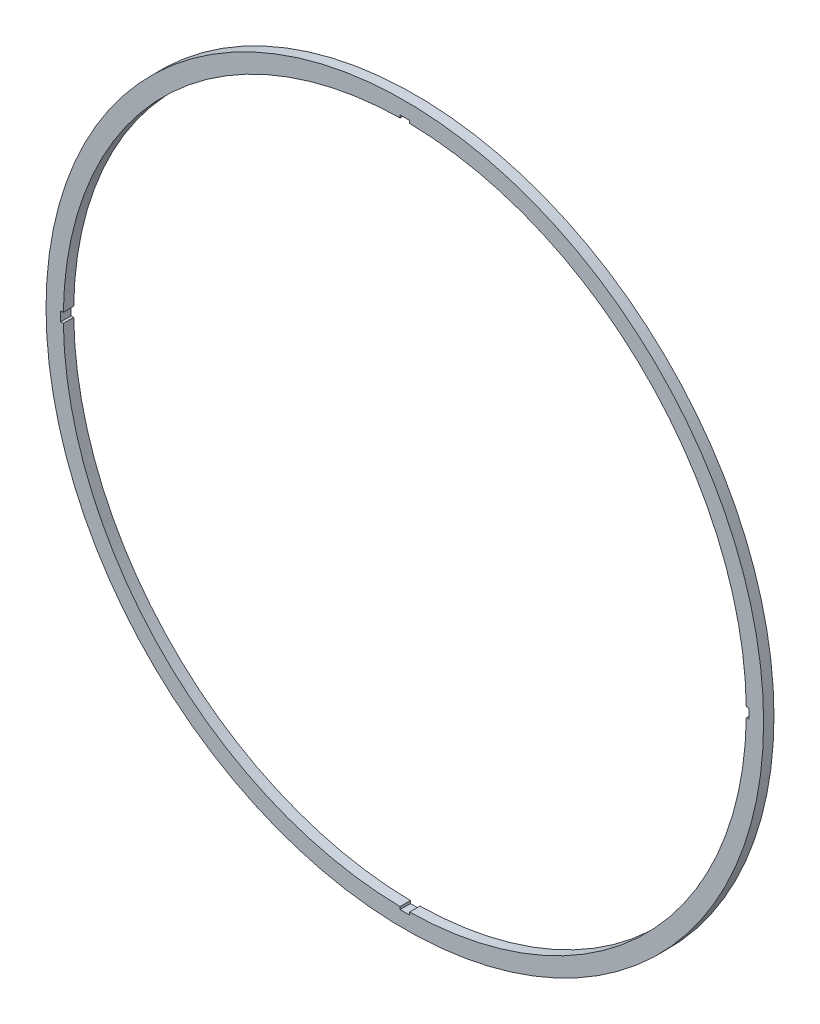
ISO-10303-21;
HEADER;
FILE_DESCRIPTION(('STEP AP214'),'2;1');
FILE_NAME('part.step','',(''),(''),'','','');
FILE_SCHEMA(('AUTOMOTIVE_DESIGN { 1 0 10303 214 1 1 1 1 }'));
ENDSEC;
DATA;
#1=APPLICATION_CONTEXT('core data for automotive mechanical design processes');
#2=APPLICATION_PROTOCOL_DEFINITION('international standard','automotive_design',2000,#1);
#3=PRODUCT_CONTEXT('',#1,'mechanical');
#4=PRODUCT('Part','Part','',(#3));
#5=PRODUCT_RELATED_PRODUCT_CATEGORY('part','',(#4));
#6=PRODUCT_DEFINITION_FORMATION('','',#4);
#7=PRODUCT_DEFINITION_CONTEXT('part definition',#1,'design');
#8=PRODUCT_DEFINITION('design','',#6,#7);
#9=PRODUCT_DEFINITION_SHAPE('','',#8);
#10=(LENGTH_UNIT() NAMED_UNIT(*) SI_UNIT(.MILLI.,.METRE.));
#11=(NAMED_UNIT(*) PLANE_ANGLE_UNIT() SI_UNIT($,.RADIAN.));
#12=(NAMED_UNIT(*) SI_UNIT($,.STERADIAN.) SOLID_ANGLE_UNIT());
#13=UNCERTAINTY_MEASURE_WITH_UNIT(LENGTH_MEASURE(1.E-05),#10,'distance_accuracy_value','');
#14=(GEOMETRIC_REPRESENTATION_CONTEXT(3) GLOBAL_UNCERTAINTY_ASSIGNED_CONTEXT((#13)) GLOBAL_UNIT_ASSIGNED_CONTEXT((#10,
#11,#12)) REPRESENTATION_CONTEXT('',''));
#15=CARTESIAN_POINT('',(0.,0.,0.));
#16=DIRECTION('',(0.,0.,1.));
#17=DIRECTION('',(1.,0.,0.));
#18=AXIS2_PLACEMENT_3D('',#15,#16,#17);
#19=CARTESIAN_POINT('',(0.,0.,12.));
#20=DIRECTION('',(0.,0.,1.));
#21=DIRECTION('',(1.,0.,0.));
#22=AXIS2_PLACEMENT_3D('',#19,#20,#21);
#23=PLANE('',#22);
#24=CARTESIAN_POINT('',(0.,0.,12.));
#25=DIRECTION('',(0.,0.,1.));
#26=DIRECTION('',(1.,0.,0.));
#27=AXIS2_PLACEMENT_3D('',#24,#25,#26);
#28=CIRCLE('',#27,415.);
#29=CARTESIAN_POINT('',(415.,0.,12.));
#30=VERTEX_POINT('',#29);
#31=EDGE_CURVE('E11',#30,#30,#28,.T.);
#32=ORIENTED_EDGE('',*,*,#31,.T.);
#33=EDGE_LOOP('',(#32));
#34=FACE_BOUND('',#33,.T.);
#35=CARTESIAN_POINT('',(0.,0.,12.));
#36=DIRECTION('',(0.,0.,1.));
#37=DIRECTION('',(1.,0.,0.));
#38=AXIS2_PLACEMENT_3D('',#35,#36,#37);
#39=CIRCLE('',#38,395.);
#40=CARTESIAN_POINT('',(-5.51162790697667,394.961544910153,12.));
#41=VERTEX_POINT('',#40);
#42=CARTESIAN_POINT('',(-394.961544910153,5.51162790695952,12.));
#43=VERTEX_POINT('',#42);
#44=EDGE_CURVE('E162',#41,#43,#39,.T.);
#45=ORIENTED_EDGE('',*,*,#44,.F.);
#46=DIRECTION('',(0.,-1.,0.));
#47=VECTOR('',#46,1.);
#48=CARTESIAN_POINT('',(-5.51162790697671,398.003407413043,12.));
#49=LINE('',#48,#47);
#50=CARTESIAN_POINT('',(-5.51162790697671,398.003407413043,12.));
#51=VERTEX_POINT('',#50);
#52=EDGE_CURVE('E153',#51,#41,#49,.T.);
#53=ORIENTED_EDGE('',*,*,#52,.F.);
#54=DIRECTION('',(-1.,0.,0.));
#55=VECTOR('',#54,1.);
#56=CARTESIAN_POINT('',(-5.51162790697671,398.003407413043,12.));
#57=LINE('',#56,#55);
#58=CARTESIAN_POINT('',(5.51162790695959,398.003407413043,12.));
#59=VERTEX_POINT('',#58);
#60=EDGE_CURVE('E217',#59,#51,#57,.T.);
#61=ORIENTED_EDGE('',*,*,#60,.F.);
#62=DIRECTION('',(0.,1.,0.));
#63=VECTOR('',#62,1.);
#64=CARTESIAN_POINT('',(5.51162790695959,398.003407413043,12.));
#65=LINE('',#64,#63);
#66=CARTESIAN_POINT('',(5.51162790695959,394.961544910153,12.));
#67=VERTEX_POINT('',#66);
#68=EDGE_CURVE('E214',#67,#59,#65,.T.);
#69=ORIENTED_EDGE('',*,*,#68,.F.);
#70=CARTESIAN_POINT('',(0.,0.,12.));
#71=DIRECTION('',(0.,0.,1.));
#72=DIRECTION('',(1.,0.,0.));
#73=AXIS2_PLACEMENT_3D('',#70,#71,#72);
#74=CIRCLE('',#73,395.);
#75=CARTESIAN_POINT('',(394.961544910153,5.51162790697673,12.));
#76=VERTEX_POINT('',#75);
#77=EDGE_CURVE('E211',#76,#67,#74,.T.);
#78=ORIENTED_EDGE('',*,*,#77,.F.);
#79=DIRECTION('',(-1.,0.,0.));
#80=VECTOR('',#79,1.);
#81=CARTESIAN_POINT('',(398.003407413043,5.51162790697673,12.));
#82=LINE('',#81,#80);
#83=CARTESIAN_POINT('',(398.003407413043,5.51162790697673,12.));
#84=VERTEX_POINT('',#83);
#85=EDGE_CURVE('E208',#84,#76,#82,.T.);
#86=ORIENTED_EDGE('',*,*,#85,.F.);
#87=DIRECTION('',(0.,1.,0.));
#88=VECTOR('',#87,1.);
#89=CARTESIAN_POINT('',(398.003407413043,5.51162790697673,12.));
#90=LINE('',#89,#88);
#91=CARTESIAN_POINT('',(398.003407413043,-5.51162790695956,12.));
#92=VERTEX_POINT('',#91);
#93=EDGE_CURVE('E205',#92,#84,#90,.T.);
#94=ORIENTED_EDGE('',*,*,#93,.F.);
#95=DIRECTION('',(1.,0.,0.));
#96=VECTOR('',#95,1.);
#97=CARTESIAN_POINT('',(398.003407413043,-5.51162790695956,12.));
#98=LINE('',#97,#96);
#99=CARTESIAN_POINT('',(394.961544910153,-5.51162790695957,12.));
#100=VERTEX_POINT('',#99);
#101=EDGE_CURVE('E202',#100,#92,#98,.T.);
#102=ORIENTED_EDGE('',*,*,#101,.F.);
#103=CARTESIAN_POINT('',(0.,0.,12.));
#104=DIRECTION('',(0.,0.,1.));
#105=DIRECTION('',(1.,0.,0.));
#106=AXIS2_PLACEMENT_3D('',#103,#104,#105);
#107=CIRCLE('',#106,395.);
#108=CARTESIAN_POINT('',(5.5116279069768,-394.961544910153,12.));
#109=VERTEX_POINT('',#108);
#110=EDGE_CURVE('E199',#109,#100,#107,.T.);
#111=ORIENTED_EDGE('',*,*,#110,.F.);
#112=DIRECTION('',(0.,1.,0.));
#113=VECTOR('',#112,1.);
#114=CARTESIAN_POINT('',(5.51162790697675,-398.003407413043,12.));
#115=LINE('',#114,#113);
#116=CARTESIAN_POINT('',(5.51162790697675,-398.003407413043,12.));
#117=VERTEX_POINT('',#116);
#118=EDGE_CURVE('E196',#117,#109,#115,.T.);
#119=ORIENTED_EDGE('',*,*,#118,.F.);
#120=DIRECTION('',(1.,0.,0.));
#121=VECTOR('',#120,1.);
#122=CARTESIAN_POINT('',(5.51162790697675,-398.003407413043,12.));
#123=LINE('',#122,#121);
#124=CARTESIAN_POINT('',(-5.51162790695954,-398.003407413043,12.));
#125=VERTEX_POINT('',#124);
#126=EDGE_CURVE('E193',#125,#117,#123,.T.);
#127=ORIENTED_EDGE('',*,*,#126,.F.);
#128=DIRECTION('',(0.,-1.,0.));
#129=VECTOR('',#128,1.);
#130=CARTESIAN_POINT('',(-5.51162790695954,-398.003407413043,12.));
#131=LINE('',#130,#129);
#132=CARTESIAN_POINT('',(-5.51162790695954,-394.961544910153,12.));
#133=VERTEX_POINT('',#132);
#134=EDGE_CURVE('E190',#133,#125,#131,.T.);
#135=ORIENTED_EDGE('',*,*,#134,.F.);
#136=CARTESIAN_POINT('',(0.,0.,12.));
#137=DIRECTION('',(0.,0.,1.));
#138=DIRECTION('',(1.,0.,0.));
#139=AXIS2_PLACEMENT_3D('',#136,#137,#138);
#140=CIRCLE('',#139,395.);
#141=CARTESIAN_POINT('',(-394.961544910153,-5.51162790697665,12.));
#142=VERTEX_POINT('',#141);
#143=EDGE_CURVE('E187',#142,#133,#140,.T.);
#144=ORIENTED_EDGE('',*,*,#143,.F.);
#145=DIRECTION('',(1.,0.,0.));
#146=VECTOR('',#145,1.);
#147=CARTESIAN_POINT('',(-398.003407413043,-5.51162790697678,12.));
#148=LINE('',#147,#146);
#149=CARTESIAN_POINT('',(-398.003407413043,-5.51162790697678,12.));
#150=VERTEX_POINT('',#149);
#151=EDGE_CURVE('E184',#150,#142,#148,.T.);
#152=ORIENTED_EDGE('',*,*,#151,.F.);
#153=DIRECTION('',(0.,-1.,0.));
#154=VECTOR('',#153,1.);
#155=CARTESIAN_POINT('',(-398.003407413043,-5.51162790697678,12.));
#156=LINE('',#155,#154);
#157=CARTESIAN_POINT('',(-398.003407413043,5.51162790695952,12.));
#158=VERTEX_POINT('',#157);
#159=EDGE_CURVE('E179',#158,#150,#156,.T.);
#160=ORIENTED_EDGE('',*,*,#159,.F.);
#161=DIRECTION('',(-1.,0.,0.));
#162=VECTOR('',#161,1.);
#163=CARTESIAN_POINT('',(-398.003407413043,5.51162790695952,12.));
#164=LINE('',#163,#162);
#165=EDGE_CURVE('E175',#43,#158,#164,.T.);
#166=ORIENTED_EDGE('',*,*,#165,.F.);
#167=EDGE_LOOP('',(#45,#53,#61,#69,#78,#86,#94,#102,#111,#119,#127,#135,#144,#152,#160,#166));
#168=FACE_BOUND('',#167,.T.);
#169=ADVANCED_FACE('F39',(#34,#168),#23,.T.);
#170=CARTESIAN_POINT('',(0.,0.,0.));
#171=DIRECTION('',(0.,0.,1.));
#172=DIRECTION('',(1.,0.,0.));
#173=AXIS2_PLACEMENT_3D('',#170,#171,#172);
#174=PLANE('',#173);
#175=CARTESIAN_POINT('',(0.,0.,0.));
#176=DIRECTION('',(0.,0.,1.));
#177=DIRECTION('',(1.,0.,0.));
#178=AXIS2_PLACEMENT_3D('',#175,#176,#177);
#179=CIRCLE('',#178,415.);
#180=CARTESIAN_POINT('',(415.,0.,0.));
#181=VERTEX_POINT('',#180);
#182=EDGE_CURVE('E43',#181,#181,#179,.T.);
#183=ORIENTED_EDGE('',*,*,#182,.F.);
#184=EDGE_LOOP('',(#183));
#185=FACE_BOUND('',#184,.T.);
#186=DIRECTION('',(0.,-1.,0.));
#187=VECTOR('',#186,1.);
#188=CARTESIAN_POINT('',(-5.51162790697671,398.003407413043,0.));
#189=LINE('',#188,#187);
#190=CARTESIAN_POINT('',(-5.51162790697671,398.003407413043,0.));
#191=VERTEX_POINT('',#190);
#192=CARTESIAN_POINT('',(-5.51162790697667,394.961544910153,0.));
#193=VERTEX_POINT('',#192);
#194=EDGE_CURVE('E63',#191,#193,#189,.T.);
#195=ORIENTED_EDGE('',*,*,#194,.T.);
#196=CARTESIAN_POINT('',(0.,0.,0.));
#197=DIRECTION('',(0.,0.,1.));
#198=DIRECTION('',(1.,0.,0.));
#199=AXIS2_PLACEMENT_3D('',#196,#197,#198);
#200=CIRCLE('',#199,395.);
#201=CARTESIAN_POINT('',(-394.961544910153,5.51162790695952,0.));
#202=VERTEX_POINT('',#201);
#203=EDGE_CURVE('E169',#193,#202,#200,.T.);
#204=ORIENTED_EDGE('',*,*,#203,.T.);
#205=DIRECTION('',(-1.,0.,0.));
#206=VECTOR('',#205,1.);
#207=CARTESIAN_POINT('',(-398.003407413043,5.51162790695952,0.));
#208=LINE('',#207,#206);
#209=CARTESIAN_POINT('',(-398.003407413043,5.51162790695952,0.));
#210=VERTEX_POINT('',#209);
#211=EDGE_CURVE('E224',#202,#210,#208,.T.);
#212=ORIENTED_EDGE('',*,*,#211,.T.);
#213=DIRECTION('',(0.,-1.,0.));
#214=VECTOR('',#213,1.);
#215=CARTESIAN_POINT('',(-398.003407413043,-5.51162790697678,0.));
#216=LINE('',#215,#214);
#217=CARTESIAN_POINT('',(-398.003407413043,-5.51162790697678,0.));
#218=VERTEX_POINT('',#217);
#219=EDGE_CURVE('E228',#210,#218,#216,.T.);
#220=ORIENTED_EDGE('',*,*,#219,.T.);
#221=DIRECTION('',(1.,0.,0.));
#222=VECTOR('',#221,1.);
#223=CARTESIAN_POINT('',(-398.003407413043,-5.51162790697678,0.));
#224=LINE('',#223,#222);
#225=CARTESIAN_POINT('',(-394.961544910153,-5.51162790697665,0.));
#226=VERTEX_POINT('',#225);
#227=EDGE_CURVE('E232',#218,#226,#224,.T.);
#228=ORIENTED_EDGE('',*,*,#227,.T.);
#229=CARTESIAN_POINT('',(0.,0.,0.));
#230=DIRECTION('',(0.,0.,1.));
#231=DIRECTION('',(1.,0.,0.));
#232=AXIS2_PLACEMENT_3D('',#229,#230,#231);
#233=CIRCLE('',#232,395.);
#234=CARTESIAN_POINT('',(-5.51162790695954,-394.961544910153,0.));
#235=VERTEX_POINT('',#234);
#236=EDGE_CURVE('E236',#226,#235,#233,.T.);
#237=ORIENTED_EDGE('',*,*,#236,.T.);
#238=DIRECTION('',(0.,-1.,0.));
#239=VECTOR('',#238,1.);
#240=CARTESIAN_POINT('',(-5.51162790695954,-398.003407413043,0.));
#241=LINE('',#240,#239);
#242=CARTESIAN_POINT('',(-5.51162790695954,-398.003407413043,0.));
#243=VERTEX_POINT('',#242);
#244=EDGE_CURVE('E240',#235,#243,#241,.T.);
#245=ORIENTED_EDGE('',*,*,#244,.T.);
#246=DIRECTION('',(1.,0.,0.));
#247=VECTOR('',#246,1.);
#248=CARTESIAN_POINT('',(5.51162790697675,-398.003407413043,0.));
#249=LINE('',#248,#247);
#250=CARTESIAN_POINT('',(5.51162790697675,-398.003407413043,0.));
#251=VERTEX_POINT('',#250);
#252=EDGE_CURVE('E244',#243,#251,#249,.T.);
#253=ORIENTED_EDGE('',*,*,#252,.T.);
#254=DIRECTION('',(0.,1.,0.));
#255=VECTOR('',#254,1.);
#256=CARTESIAN_POINT('',(5.51162790697675,-398.003407413043,0.));
#257=LINE('',#256,#255);
#258=CARTESIAN_POINT('',(5.5116279069768,-394.961544910153,0.));
#259=VERTEX_POINT('',#258);
#260=EDGE_CURVE('E248',#251,#259,#257,.T.);
#261=ORIENTED_EDGE('',*,*,#260,.T.);
#262=CARTESIAN_POINT('',(0.,0.,0.));
#263=DIRECTION('',(0.,0.,1.));
#264=DIRECTION('',(1.,0.,0.));
#265=AXIS2_PLACEMENT_3D('',#262,#263,#264);
#266=CIRCLE('',#265,395.);
#267=CARTESIAN_POINT('',(394.961544910153,-5.51162790695957,0.));
#268=VERTEX_POINT('',#267);
#269=EDGE_CURVE('E252',#259,#268,#266,.T.);
#270=ORIENTED_EDGE('',*,*,#269,.T.);
#271=DIRECTION('',(1.,0.,0.));
#272=VECTOR('',#271,1.);
#273=CARTESIAN_POINT('',(398.003407413043,-5.51162790695956,0.));
#274=LINE('',#273,#272);
#275=CARTESIAN_POINT('',(398.003407413043,-5.51162790695956,0.));
#276=VERTEX_POINT('',#275);
#277=EDGE_CURVE('E256',#268,#276,#274,.T.);
#278=ORIENTED_EDGE('',*,*,#277,.T.);
#279=DIRECTION('',(0.,1.,0.));
#280=VECTOR('',#279,1.);
#281=CARTESIAN_POINT('',(398.003407413043,5.51162790697673,0.));
#282=LINE('',#281,#280);
#283=CARTESIAN_POINT('',(398.003407413043,5.51162790697673,0.));
#284=VERTEX_POINT('',#283);
#285=EDGE_CURVE('E260',#276,#284,#282,.T.);
#286=ORIENTED_EDGE('',*,*,#285,.T.);
#287=DIRECTION('',(-1.,0.,0.));
#288=VECTOR('',#287,1.);
#289=CARTESIAN_POINT('',(398.003407413043,5.51162790697673,0.));
#290=LINE('',#289,#288);
#291=CARTESIAN_POINT('',(394.961544910153,5.51162790697673,0.));
#292=VERTEX_POINT('',#291);
#293=EDGE_CURVE('E264',#284,#292,#290,.T.);
#294=ORIENTED_EDGE('',*,*,#293,.T.);
#295=CARTESIAN_POINT('',(0.,0.,0.));
#296=DIRECTION('',(0.,0.,1.));
#297=DIRECTION('',(1.,0.,0.));
#298=AXIS2_PLACEMENT_3D('',#295,#296,#297);
#299=CIRCLE('',#298,395.);
#300=CARTESIAN_POINT('',(5.51162790695959,394.961544910153,0.));
#301=VERTEX_POINT('',#300);
#302=EDGE_CURVE('E268',#292,#301,#299,.T.);
#303=ORIENTED_EDGE('',*,*,#302,.T.);
#304=DIRECTION('',(0.,1.,0.));
#305=VECTOR('',#304,1.);
#306=CARTESIAN_POINT('',(5.51162790695959,398.003407413043,0.));
#307=LINE('',#306,#305);
#308=CARTESIAN_POINT('',(5.51162790695959,398.003407413043,0.));
#309=VERTEX_POINT('',#308);
#310=EDGE_CURVE('E272',#301,#309,#307,.T.);
#311=ORIENTED_EDGE('',*,*,#310,.T.);
#312=DIRECTION('',(-1.,0.,0.));
#313=VECTOR('',#312,1.);
#314=CARTESIAN_POINT('',(-5.51162790697671,398.003407413043,0.));
#315=LINE('',#314,#313);
#316=EDGE_CURVE('E163',#309,#191,#315,.T.);
#317=ORIENTED_EDGE('',*,*,#316,.T.);
#318=EDGE_LOOP('',(#195,#204,#212,#220,#228,#237,#245,#253,#261,#270,#278,#286,#294,#303,#311,#317));
#319=FACE_BOUND('',#318,.T.);
#320=ADVANCED_FACE('F326',(#185,#319),#174,.F.);
#321=CARTESIAN_POINT('',(0.,0.,12.));
#322=DIRECTION('',(0.,0.,-1.));
#323=DIRECTION('',(-1.,0.,0.));
#324=AXIS2_PLACEMENT_3D('',#321,#322,#323);
#325=CYLINDRICAL_SURFACE('',#324,415.);
#326=ORIENTED_EDGE('',*,*,#31,.F.);
#327=EDGE_LOOP('',(#326));
#328=FACE_BOUND('',#327,.T.);
#329=ORIENTED_EDGE('',*,*,#182,.T.);
#330=EDGE_LOOP('',(#329));
#331=FACE_BOUND('',#330,.T.);
#332=ADVANCED_FACE('F41',(#328,#331),#325,.T.);
#333=CARTESIAN_POINT('',(-5.51162790697671,398.003407413043,12.));
#334=DIRECTION('',(1.,0.,0.));
#335=DIRECTION('',(0.,1.,0.));
#336=AXIS2_PLACEMENT_3D('',#333,#334,#335);
#337=PLANE('',#336);
#338=ORIENTED_EDGE('',*,*,#194,.F.);
#339=DIRECTION('',(0.,0.,-1.));
#340=VECTOR('',#339,1.);
#341=CARTESIAN_POINT('',(-5.51162790697671,398.003407413043,12.));
#342=LINE('',#341,#340);
#343=EDGE_CURVE('E157',#51,#191,#342,.T.);
#344=ORIENTED_EDGE('',*,*,#343,.F.);
#345=ORIENTED_EDGE('',*,*,#52,.T.);
#346=DIRECTION('',(0.,0.,-1.));
#347=VECTOR('',#346,1.);
#348=CARTESIAN_POINT('',(-5.51162790697667,394.961544910153,12.));
#349=LINE('',#348,#347);
#350=EDGE_CURVE('E156',#41,#193,#349,.T.);
#351=ORIENTED_EDGE('',*,*,#350,.T.);
#352=EDGE_LOOP('',(#338,#344,#345,#351));
#353=FACE_BOUND('',#352,.T.);
#354=ADVANCED_FACE('F155',(#353),#337,.T.);
#355=CARTESIAN_POINT('',(0.,0.,12.));
#356=DIRECTION('',(0.,0.,-1.));
#357=DIRECTION('',(-1.,0.,0.));
#358=AXIS2_PLACEMENT_3D('',#355,#356,#357);
#359=CYLINDRICAL_SURFACE('',#358,395.);
#360=ORIENTED_EDGE('',*,*,#203,.F.);
#361=ORIENTED_EDGE('',*,*,#350,.F.);
#362=ORIENTED_EDGE('',*,*,#44,.T.);
#363=DIRECTION('',(0.,0.,-1.));
#364=VECTOR('',#363,1.);
#365=CARTESIAN_POINT('',(-394.961544910153,5.51162790695952,12.));
#366=LINE('',#365,#364);
#367=EDGE_CURVE('E171',#43,#202,#366,.T.);
#368=ORIENTED_EDGE('',*,*,#367,.T.);
#369=EDGE_LOOP('',(#360,#361,#362,#368));
#370=FACE_BOUND('',#369,.T.);
#371=ADVANCED_FACE('F166',(#370),#359,.F.);
#372=CARTESIAN_POINT('',(-398.003407413043,5.51162790695952,12.));
#373=DIRECTION('',(0.,-1.,0.));
#374=DIRECTION('',(1.,0.,0.));
#375=AXIS2_PLACEMENT_3D('',#372,#373,#374);
#376=PLANE('',#375);
#377=ORIENTED_EDGE('',*,*,#211,.F.);
#378=ORIENTED_EDGE('',*,*,#367,.F.);
#379=ORIENTED_EDGE('',*,*,#165,.T.);
#380=DIRECTION('',(0.,0.,-1.));
#381=VECTOR('',#380,1.);
#382=CARTESIAN_POINT('',(-398.003407413043,5.51162790695952,12.));
#383=LINE('',#382,#381);
#384=EDGE_CURVE('E316',#158,#210,#383,.T.);
#385=ORIENTED_EDGE('',*,*,#384,.T.);
#386=EDGE_LOOP('',(#377,#378,#379,#385));
#387=FACE_BOUND('',#386,.T.);
#388=ADVANCED_FACE('F322',(#387),#376,.T.);
#389=CARTESIAN_POINT('',(-398.003407413043,-5.51162790697678,12.));
#390=DIRECTION('',(1.,0.,0.));
#391=DIRECTION('',(0.,0.,-1.));
#392=AXIS2_PLACEMENT_3D('',#389,#390,#391);
#393=PLANE('',#392);
#394=ORIENTED_EDGE('',*,*,#219,.F.);
#395=ORIENTED_EDGE('',*,*,#384,.F.);
#396=ORIENTED_EDGE('',*,*,#159,.T.);
#397=DIRECTION('',(0.,0.,-1.));
#398=VECTOR('',#397,1.);
#399=CARTESIAN_POINT('',(-398.003407413043,-5.51162790697678,12.));
#400=LINE('',#399,#398);
#401=EDGE_CURVE('E313',#150,#218,#400,.T.);
#402=ORIENTED_EDGE('',*,*,#401,.T.);
#403=EDGE_LOOP('',(#394,#395,#396,#402));
#404=FACE_BOUND('',#403,.T.);
#405=ADVANCED_FACE('F384',(#404),#393,.T.);
#406=CARTESIAN_POINT('',(-398.003407413043,-5.51162790697678,12.));
#407=DIRECTION('',(0.,1.,0.));
#408=DIRECTION('',(-1.,0.,0.));
#409=AXIS2_PLACEMENT_3D('',#406,#407,#408);
#410=PLANE('',#409);
#411=ORIENTED_EDGE('',*,*,#227,.F.);
#412=ORIENTED_EDGE('',*,*,#401,.F.);
#413=ORIENTED_EDGE('',*,*,#151,.T.);
#414=DIRECTION('',(0.,0.,-1.));
#415=VECTOR('',#414,1.);
#416=CARTESIAN_POINT('',(-394.961544910153,-5.51162790697665,12.));
#417=LINE('',#416,#415);
#418=EDGE_CURVE('E310',#142,#226,#417,.T.);
#419=ORIENTED_EDGE('',*,*,#418,.T.);
#420=EDGE_LOOP('',(#411,#412,#413,#419));
#421=FACE_BOUND('',#420,.T.);
#422=ADVANCED_FACE('F381',(#421),#410,.T.);
#423=CARTESIAN_POINT('',(0.,0.,12.));
#424=DIRECTION('',(0.,0.,-1.));
#425=DIRECTION('',(-1.,0.,0.));
#426=AXIS2_PLACEMENT_3D('',#423,#424,#425);
#427=CYLINDRICAL_SURFACE('',#426,395.);
#428=ORIENTED_EDGE('',*,*,#236,.F.);
#429=ORIENTED_EDGE('',*,*,#418,.F.);
#430=ORIENTED_EDGE('',*,*,#143,.T.);
#431=DIRECTION('',(0.,0.,-1.));
#432=VECTOR('',#431,1.);
#433=CARTESIAN_POINT('',(-5.51162790695954,-394.961544910153,12.));
#434=LINE('',#433,#432);
#435=EDGE_CURVE('E307',#133,#235,#434,.T.);
#436=ORIENTED_EDGE('',*,*,#435,.T.);
#437=EDGE_LOOP('',(#428,#429,#430,#436));
#438=FACE_BOUND('',#437,.T.);
#439=ADVANCED_FACE('F378',(#438),#427,.F.);
#440=CARTESIAN_POINT('',(-5.51162790695954,-398.003407413043,12.));
#441=DIRECTION('',(1.,0.,0.));
#442=DIRECTION('',(0.,1.,0.));
#443=AXIS2_PLACEMENT_3D('',#440,#441,#442);
#444=PLANE('',#443);
#445=ORIENTED_EDGE('',*,*,#244,.F.);
#446=ORIENTED_EDGE('',*,*,#435,.F.);
#447=ORIENTED_EDGE('',*,*,#134,.T.);
#448=DIRECTION('',(0.,0.,-1.));
#449=VECTOR('',#448,1.);
#450=CARTESIAN_POINT('',(-5.51162790695954,-398.003407413043,12.));
#451=LINE('',#450,#449);
#452=EDGE_CURVE('E304',#125,#243,#451,.T.);
#453=ORIENTED_EDGE('',*,*,#452,.T.);
#454=EDGE_LOOP('',(#445,#446,#447,#453));
#455=FACE_BOUND('',#454,.T.);
#456=ADVANCED_FACE('F371',(#455),#444,.T.);
#457=CARTESIAN_POINT('',(5.51162790697675,-398.003407413043,12.));
#458=DIRECTION('',(0.,1.,0.));
#459=DIRECTION('',(0.,0.,1.));
#460=AXIS2_PLACEMENT_3D('',#457,#458,#459);
#461=PLANE('',#460);
#462=ORIENTED_EDGE('',*,*,#252,.F.);
#463=ORIENTED_EDGE('',*,*,#452,.F.);
#464=ORIENTED_EDGE('',*,*,#126,.T.);
#465=DIRECTION('',(0.,0.,-1.));
#466=VECTOR('',#465,1.);
#467=CARTESIAN_POINT('',(5.51162790697675,-398.003407413043,12.));
#468=LINE('',#467,#466);
#469=EDGE_CURVE('E301',#117,#251,#468,.T.);
#470=ORIENTED_EDGE('',*,*,#469,.T.);
#471=EDGE_LOOP('',(#462,#463,#464,#470));
#472=FACE_BOUND('',#471,.T.);
#473=ADVANCED_FACE('F367',(#472),#461,.T.);
#474=CARTESIAN_POINT('',(5.51162790697675,-398.003407413043,12.));
#475=DIRECTION('',(-1.,0.,0.));
#476=DIRECTION('',(0.,-1.,0.));
#477=AXIS2_PLACEMENT_3D('',#474,#475,#476);
#478=PLANE('',#477);
#479=ORIENTED_EDGE('',*,*,#260,.F.);
#480=ORIENTED_EDGE('',*,*,#469,.F.);
#481=ORIENTED_EDGE('',*,*,#118,.T.);
#482=DIRECTION('',(0.,0.,-1.));
#483=VECTOR('',#482,1.);
#484=CARTESIAN_POINT('',(5.5116279069768,-394.961544910153,12.));
#485=LINE('',#484,#483);
#486=EDGE_CURVE('E298',#109,#259,#485,.T.);
#487=ORIENTED_EDGE('',*,*,#486,.T.);
#488=EDGE_LOOP('',(#479,#480,#481,#487));
#489=FACE_BOUND('',#488,.T.);
#490=ADVANCED_FACE('F364',(#489),#478,.T.);
#491=CARTESIAN_POINT('',(0.,0.,12.));
#492=DIRECTION('',(0.,0.,-1.));
#493=DIRECTION('',(-1.,0.,0.));
#494=AXIS2_PLACEMENT_3D('',#491,#492,#493);
#495=CYLINDRICAL_SURFACE('',#494,395.);
#496=ORIENTED_EDGE('',*,*,#269,.F.);
#497=ORIENTED_EDGE('',*,*,#486,.F.);
#498=ORIENTED_EDGE('',*,*,#110,.T.);
#499=DIRECTION('',(0.,0.,-1.));
#500=VECTOR('',#499,1.);
#501=CARTESIAN_POINT('',(394.961544910153,-5.51162790695957,12.));
#502=LINE('',#501,#500);
#503=EDGE_CURVE('E295',#100,#268,#502,.T.);
#504=ORIENTED_EDGE('',*,*,#503,.T.);
#505=EDGE_LOOP('',(#496,#497,#498,#504));
#506=FACE_BOUND('',#505,.T.);
#507=ADVANCED_FACE('F356',(#506),#495,.F.);
#508=CARTESIAN_POINT('',(398.003407413043,-5.51162790695956,12.));
#509=DIRECTION('',(0.,1.,0.));
#510=DIRECTION('',(-1.,0.,0.));
#511=AXIS2_PLACEMENT_3D('',#508,#509,#510);
#512=PLANE('',#511);
#513=ORIENTED_EDGE('',*,*,#277,.F.);
#514=ORIENTED_EDGE('',*,*,#503,.F.);
#515=ORIENTED_EDGE('',*,*,#101,.T.);
#516=DIRECTION('',(0.,0.,-1.));
#517=VECTOR('',#516,1.);
#518=CARTESIAN_POINT('',(398.003407413043,-5.51162790695956,12.));
#519=LINE('',#518,#517);
#520=EDGE_CURVE('E292',#92,#276,#519,.T.);
#521=ORIENTED_EDGE('',*,*,#520,.T.);
#522=EDGE_LOOP('',(#513,#514,#515,#521));
#523=FACE_BOUND('',#522,.T.);
#524=ADVANCED_FACE('F352',(#523),#512,.T.);
#525=CARTESIAN_POINT('',(398.003407413043,5.51162790697673,12.));
#526=DIRECTION('',(-1.,0.,0.));
#527=DIRECTION('',(0.,0.,1.));
#528=AXIS2_PLACEMENT_3D('',#525,#526,#527);
#529=PLANE('',#528);
#530=ORIENTED_EDGE('',*,*,#285,.F.);
#531=ORIENTED_EDGE('',*,*,#520,.F.);
#532=ORIENTED_EDGE('',*,*,#93,.T.);
#533=DIRECTION('',(0.,0.,-1.));
#534=VECTOR('',#533,1.);
#535=CARTESIAN_POINT('',(398.003407413043,5.51162790697673,12.));
#536=LINE('',#535,#534);
#537=EDGE_CURVE('E289',#84,#284,#536,.T.);
#538=ORIENTED_EDGE('',*,*,#537,.T.);
#539=EDGE_LOOP('',(#530,#531,#532,#538));
#540=FACE_BOUND('',#539,.T.);
#541=ADVANCED_FACE('F349',(#540),#529,.T.);
#542=CARTESIAN_POINT('',(398.003407413043,5.51162790697673,12.));
#543=DIRECTION('',(0.,-1.,0.));
#544=DIRECTION('',(1.,0.,0.));
#545=AXIS2_PLACEMENT_3D('',#542,#543,#544);
#546=PLANE('',#545);
#547=ORIENTED_EDGE('',*,*,#293,.F.);
#548=ORIENTED_EDGE('',*,*,#537,.F.);
#549=ORIENTED_EDGE('',*,*,#85,.T.);
#550=DIRECTION('',(0.,0.,-1.));
#551=VECTOR('',#550,1.);
#552=CARTESIAN_POINT('',(394.961544910153,5.51162790697673,12.));
#553=LINE('',#552,#551);
#554=EDGE_CURVE('E286',#76,#292,#553,.T.);
#555=ORIENTED_EDGE('',*,*,#554,.T.);
#556=EDGE_LOOP('',(#547,#548,#549,#555));
#557=FACE_BOUND('',#556,.T.);
#558=ADVANCED_FACE('F341',(#557),#546,.T.);
#559=CARTESIAN_POINT('',(0.,0.,12.));
#560=DIRECTION('',(0.,0.,-1.));
#561=DIRECTION('',(-1.,0.,0.));
#562=AXIS2_PLACEMENT_3D('',#559,#560,#561);
#563=CYLINDRICAL_SURFACE('',#562,395.);
#564=ORIENTED_EDGE('',*,*,#302,.F.);
#565=ORIENTED_EDGE('',*,*,#554,.F.);
#566=ORIENTED_EDGE('',*,*,#77,.T.);
#567=DIRECTION('',(0.,0.,-1.));
#568=VECTOR('',#567,1.);
#569=CARTESIAN_POINT('',(5.51162790695959,394.961544910153,12.));
#570=LINE('',#569,#568);
#571=EDGE_CURVE('E283',#67,#301,#570,.T.);
#572=ORIENTED_EDGE('',*,*,#571,.T.);
#573=EDGE_LOOP('',(#564,#565,#566,#572));
#574=FACE_BOUND('',#573,.T.);
#575=ADVANCED_FACE('F337',(#574),#563,.F.);
#576=CARTESIAN_POINT('',(5.51162790695959,398.003407413043,12.));
#577=DIRECTION('',(-1.,0.,0.));
#578=DIRECTION('',(0.,-1.,0.));
#579=AXIS2_PLACEMENT_3D('',#576,#577,#578);
#580=PLANE('',#579);
#581=ORIENTED_EDGE('',*,*,#310,.F.);
#582=ORIENTED_EDGE('',*,*,#571,.F.);
#583=ORIENTED_EDGE('',*,*,#68,.T.);
#584=DIRECTION('',(0.,0.,-1.));
#585=VECTOR('',#584,1.);
#586=CARTESIAN_POINT('',(5.51162790695959,398.003407413043,12.));
#587=LINE('',#586,#585);
#588=EDGE_CURVE('E55',#59,#309,#587,.T.);
#589=ORIENTED_EDGE('',*,*,#588,.T.);
#590=EDGE_LOOP('',(#581,#582,#583,#589));
#591=FACE_BOUND('',#590,.T.);
#592=ADVANCED_FACE('F334',(#591),#580,.T.);
#593=CARTESIAN_POINT('',(-5.51162790697671,398.003407413043,12.));
#594=DIRECTION('',(0.,-1.,0.));
#595=DIRECTION('',(0.,0.,-1.));
#596=AXIS2_PLACEMENT_3D('',#593,#594,#595);
#597=PLANE('',#596);
#598=ORIENTED_EDGE('',*,*,#316,.F.);
#599=ORIENTED_EDGE('',*,*,#588,.F.);
#600=ORIENTED_EDGE('',*,*,#60,.T.);
#601=ORIENTED_EDGE('',*,*,#343,.T.);
#602=EDGE_LOOP('',(#598,#599,#600,#601));
#603=FACE_BOUND('',#602,.T.);
#604=ADVANCED_FACE('F328',(#603),#597,.T.);
#605=CLOSED_SHELL('',(#169,#320,#332,#354,#371,#388,#405,#422,#439,#456,#473,#490,#507,#524,
#541,#558,#575,#592,#604));
#606=MANIFOLD_SOLID_BREP('B2',#605);
#607=ADVANCED_BREP_SHAPE_REPRESENTATION('',(#18,#606),#14);
#608=SHAPE_DEFINITION_REPRESENTATION(#9,#607);
ENDSEC;
END-ISO-10303-21;
